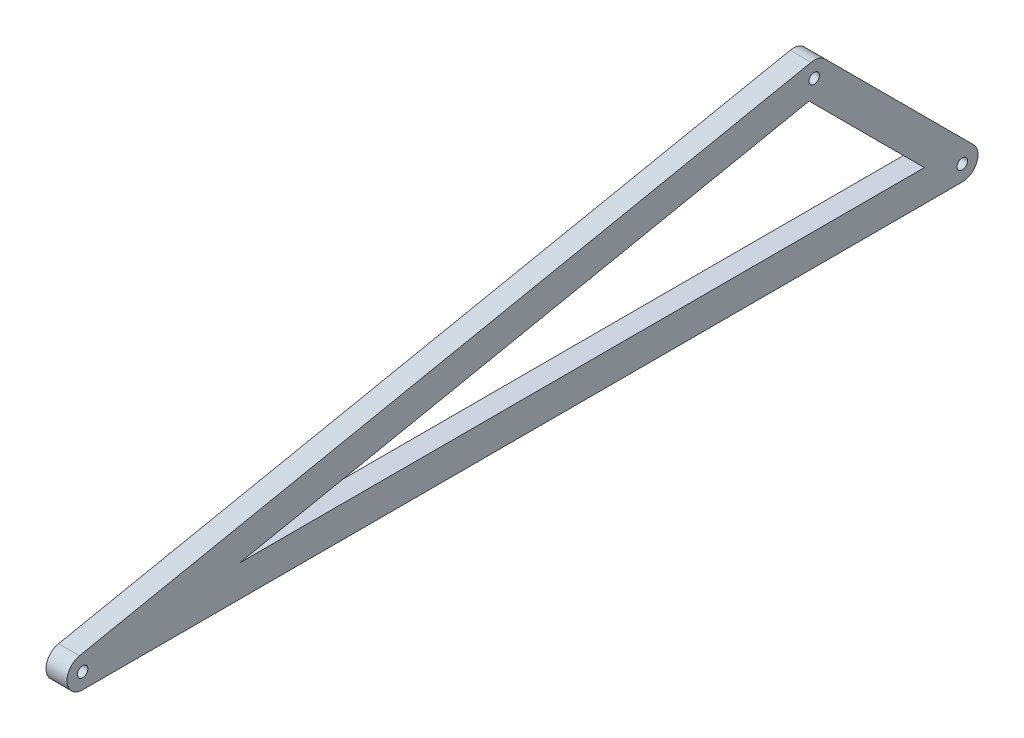
ISO-10303-21;
HEADER;
FILE_DESCRIPTION(('STEP AP214'),'2;1');
FILE_NAME('part.step','',(''),(''),'','','');
FILE_SCHEMA(('AUTOMOTIVE_DESIGN { 1 0 10303 214 1 1 1 1 }'));
ENDSEC;
DATA;
#1=APPLICATION_CONTEXT('core data for automotive mechanical design processes');
#2=APPLICATION_PROTOCOL_DEFINITION('international standard','automotive_design',2000,#1);
#3=PRODUCT_CONTEXT('',#1,'mechanical');
#4=PRODUCT('Part','Part','',(#3));
#5=PRODUCT_RELATED_PRODUCT_CATEGORY('part','',(#4));
#6=PRODUCT_DEFINITION_FORMATION('','',#4);
#7=PRODUCT_DEFINITION_CONTEXT('part definition',#1,'design');
#8=PRODUCT_DEFINITION('design','',#6,#7);
#9=PRODUCT_DEFINITION_SHAPE('','',#8);
#10=(LENGTH_UNIT() NAMED_UNIT(*) SI_UNIT(.MILLI.,.METRE.));
#11=(NAMED_UNIT(*) PLANE_ANGLE_UNIT() SI_UNIT($,.RADIAN.));
#12=(NAMED_UNIT(*) SI_UNIT($,.STERADIAN.) SOLID_ANGLE_UNIT());
#13=UNCERTAINTY_MEASURE_WITH_UNIT(LENGTH_MEASURE(1.E-05),#10,'distance_accuracy_value','');
#14=(GEOMETRIC_REPRESENTATION_CONTEXT(3) GLOBAL_UNCERTAINTY_ASSIGNED_CONTEXT((#13)) GLOBAL_UNIT_ASSIGNED_CONTEXT((#10,
#11,#12)) REPRESENTATION_CONTEXT('',''));
#15=CARTESIAN_POINT('',(0.,0.,0.));
#16=DIRECTION('',(0.,0.,1.));
#17=DIRECTION('',(1.,0.,0.));
#18=AXIS2_PLACEMENT_3D('',#15,#16,#17);
#19=CARTESIAN_POINT('',(2.,3.02286127487392,-75.2533035137491));
#20=DIRECTION('',(-1.,0.,0.));
#21=DIRECTION('',(0.,0.,1.));
#22=AXIS2_PLACEMENT_3D('',#19,#20,#21);
#23=CYLINDRICAL_SURFACE('',#22,1.5);
#24=DIRECTION('',(-1.,0.,0.));
#25=VECTOR('',#24,1.);
#26=CARTESIAN_POINT('',(90.6727286923234,4.08352144665374,-76.3139636855289));
#27=LINE('',#26,#25);
#28=CARTESIAN_POINT('',(2.,4.08352144665374,-76.3139636855289));
#29=VERTEX_POINT('',#28);
#30=CARTESIAN_POINT('',(0.,4.08352144665374,-76.3139636855289));
#31=VERTEX_POINT('',#30);
#32=EDGE_CURVE('E163',#29,#31,#27,.T.);
#33=ORIENTED_EDGE('',*,*,#32,.F.);
#34=CARTESIAN_POINT('',(2.,3.02286127487392,-75.2533035137491));
#35=DIRECTION('',(1.,0.,0.));
#36=DIRECTION('',(0.,0.,-1.));
#37=AXIS2_PLACEMENT_3D('',#34,#35,#36);
#38=CIRCLE('',#37,1.5);
#39=CARTESIAN_POINT('',(2.,1.52286127487392,-75.2533035137491));
#40=VERTEX_POINT('',#39);
#41=EDGE_CURVE('E103',#40,#29,#38,.T.);
#42=ORIENTED_EDGE('',*,*,#41,.F.);
#43=DIRECTION('',(-1.,0.,0.));
#44=VECTOR('',#43,1.);
#45=CARTESIAN_POINT('',(2.,1.52286127487392,-75.2533035137491));
#46=LINE('',#45,#44);
#47=CARTESIAN_POINT('',(0.,1.52286127487392,-75.2533035137491));
#48=VERTEX_POINT('',#47);
#49=EDGE_CURVE('E89',#40,#48,#46,.T.);
#50=ORIENTED_EDGE('',*,*,#49,.T.);
#51=CARTESIAN_POINT('',(0.,3.02286127487392,-75.2533035137491));
#52=DIRECTION('',(1.,0.,0.));
#53=DIRECTION('',(0.,0.,-1.));
#54=AXIS2_PLACEMENT_3D('',#51,#52,#53);
#55=CIRCLE('',#54,1.5);
#56=EDGE_CURVE('E96',#48,#31,#55,.T.);
#57=ORIENTED_EDGE('',*,*,#56,.T.);
#58=EDGE_LOOP('',(#33,#42,#50,#57));
#59=FACE_BOUND('',#58,.T.);
#60=ADVANCED_FACE('F49',(#59),#23,.T.);
#61=CARTESIAN_POINT('',(2.,3.02286127487392,8.7466964862509));
#62=DIRECTION('',(1.,0.,0.));
#63=DIRECTION('',(0.,0.,-1.));
#64=AXIS2_PLACEMENT_3D('',#61,#62,#63);
#65=PLANE('',#64);
#66=DIRECTION('',(0.,0.,1.));
#67=VECTOR('',#66,1.);
#68=CARTESIAN_POINT('',(2.,4.52286127487392,8.7466964862509));
#69=LINE('',#68,#67);
#70=CARTESIAN_POINT('',(2.,4.52286127487392,-71.6319831701894));
#71=VERTEX_POINT('',#70);
#72=CARTESIAN_POINT('',(2.,4.52286127487393,-6.22270104990553));
#73=VERTEX_POINT('',#72);
#74=EDGE_CURVE('E104',#71,#73,#69,.T.);
#75=ORIENTED_EDGE('',*,*,#74,.T.);
#76=DIRECTION('',(0.,-0.19841658031221,0.980117778972103));
#77=VECTOR('',#76,1.);
#78=CARTESIAN_POINT('',(2.,15.5350867367303,-60.6197577083331));
#79=LINE('',#78,#77);
#80=CARTESIAN_POINT('',(2.,15.5350867367303,-60.6197577083331));
#81=VERTEX_POINT('',#80);
#82=EDGE_CURVE('E155',#81,#73,#79,.T.);
#83=ORIENTED_EDGE('',*,*,#82,.F.);
#84=DIRECTION('',(0.,0.707106781186547,0.707106781186548));
#85=VECTOR('',#84,1.);
#86=CARTESIAN_POINT('',(2.,1.9622011030941,-74.1926433419693));
#87=LINE('',#86,#85);
#88=EDGE_CURVE('E64',#71,#81,#87,.T.);
#89=ORIENTED_EDGE('',*,*,#88,.F.);
#90=EDGE_LOOP('',(#75,#83,#89));
#91=FACE_BOUND('',#90,.T.);
#92=DIRECTION('',(0.,0.,-1.));
#93=VECTOR('',#92,1.);
#94=CARTESIAN_POINT('',(2.,1.52286127487392,8.7466964862509));
#95=LINE('',#94,#93);
#96=CARTESIAN_POINT('',(2.,1.52286127487392,8.7466964862509));
#97=VERTEX_POINT('',#96);
#98=EDGE_CURVE('E73',#97,#40,#95,.T.);
#99=ORIENTED_EDGE('',*,*,#98,.T.);
#100=ORIENTED_EDGE('',*,*,#41,.T.);
#101=DIRECTION('',(0.,-0.707106781186547,-0.707106781186548));
#102=VECTOR('',#101,1.);
#103=CARTESIAN_POINT('',(2.,18.2256570703847,-62.171828061798));
#104=LINE('',#103,#102);
#105=CARTESIAN_POINT('',(2.,18.2256570703847,-62.171828061798));
#106=VERTEX_POINT('',#105);
#107=EDGE_CURVE('E160',#106,#29,#104,.T.);
#108=ORIENTED_EDGE('',*,*,#107,.F.);
#109=CARTESIAN_POINT('',(2.,17.1649968986049,-61.1111678900182));
#110=DIRECTION('',(1.,0.,0.));
#111=DIRECTION('',(0.,0.,-1.));
#112=AXIS2_PLACEMENT_3D('',#109,#110,#111);
#113=CIRCLE('',#112,1.50000000000001);
#114=CARTESIAN_POINT('',(2.,18.635173567063,-60.8135430195498));
#115=VERTEX_POINT('',#114);
#116=EDGE_CURVE('E164',#115,#106,#113,.F.);
#117=ORIENTED_EDGE('',*,*,#116,.F.);
#118=DIRECTION('',(0.,0.19841658031221,-0.980117778972103));
#119=VECTOR('',#118,1.);
#120=CARTESIAN_POINT('',(2.,18.635173567063,-60.8135430195498));
#121=LINE('',#120,#119);
#122=CARTESIAN_POINT('',(2.00000000000003,4.49303794333207,9.04432135671922));
#123=VERTEX_POINT('',#122);
#124=EDGE_CURVE('E168',#123,#115,#121,.T.);
#125=ORIENTED_EDGE('',*,*,#124,.F.);
#126=CARTESIAN_POINT('',(2.,3.02286127487392,8.7466964862509));
#127=DIRECTION('',(1.,0.,0.));
#128=DIRECTION('',(0.,0.,-1.));
#129=AXIS2_PLACEMENT_3D('',#126,#127,#128);
#130=CIRCLE('',#129,1.5);
#131=EDGE_CURVE('E115',#123,#97,#130,.T.);
#132=ORIENTED_EDGE('',*,*,#131,.T.);
#133=EDGE_LOOP('',(#99,#100,#108,#117,#125,#132));
#134=FACE_BOUND('',#133,.T.);
#135=CARTESIAN_POINT('',(2.,3.02286127487392,8.7466964862509));
#136=DIRECTION('',(1.,0.,0.));
#137=DIRECTION('',(0.,0.,-1.));
#138=AXIS2_PLACEMENT_3D('',#135,#136,#137);
#139=CIRCLE('',#138,0.499999999999999);
#140=CARTESIAN_POINT('',(2.,3.02286127487392,8.24669648625091));
#141=VERTEX_POINT('',#140);
#142=EDGE_CURVE('E187',#141,#141,#139,.T.);
#143=ORIENTED_EDGE('',*,*,#142,.F.);
#144=EDGE_LOOP('',(#143));
#145=FACE_BOUND('',#144,.T.);
#146=CARTESIAN_POINT('',(2.,17.1649968986049,-61.1111678900182));
#147=DIRECTION('',(1.,0.,0.));
#148=DIRECTION('',(0.,0.,-1.));
#149=AXIS2_PLACEMENT_3D('',#146,#147,#148);
#150=CIRCLE('',#149,0.499999999999999);
#151=CARTESIAN_POINT('',(2.,17.1649968986049,-61.6111678900182));
#152=VERTEX_POINT('',#151);
#153=EDGE_CURVE('E151',#152,#152,#150,.F.);
#154=ORIENTED_EDGE('',*,*,#153,.T.);
#155=EDGE_LOOP('',(#154));
#156=FACE_BOUND('',#155,.T.);
#157=CARTESIAN_POINT('',(2.,3.02286127487392,-75.2533035137491));
#158=DIRECTION('',(1.,0.,0.));
#159=DIRECTION('',(0.,0.,-1.));
#160=AXIS2_PLACEMENT_3D('',#157,#158,#159);
#161=CIRCLE('',#160,0.499999999999999);
#162=CARTESIAN_POINT('',(2.,3.02286127487392,-75.7533035137491));
#163=VERTEX_POINT('',#162);
#164=EDGE_CURVE('E181',#163,#163,#161,.T.);
#165=ORIENTED_EDGE('',*,*,#164,.F.);
#166=EDGE_LOOP('',(#165));
#167=FACE_BOUND('',#166,.T.);
#168=ADVANCED_FACE('F231',(#91,#134,#145,#156,#167),#65,.T.);
#169=CARTESIAN_POINT('',(0.,3.02286127487392,8.7466964862509));
#170=DIRECTION('',(1.,0.,0.));
#171=DIRECTION('',(0.,0.,-1.));
#172=AXIS2_PLACEMENT_3D('',#169,#170,#171);
#173=PLANE('',#172);
#174=DIRECTION('',(0.,-0.19841658031221,0.980117778972103));
#175=VECTOR('',#174,1.);
#176=CARTESIAN_POINT('',(0.,15.5350867367303,-60.6197577083331));
#177=LINE('',#176,#175);
#178=CARTESIAN_POINT('',(0.,15.5350867367303,-60.6197577083331));
#179=VERTEX_POINT('',#178);
#180=CARTESIAN_POINT('',(0.,4.52286127487393,-6.22270104990553));
#181=VERTEX_POINT('',#180);
#182=EDGE_CURVE('E134',#179,#181,#177,.T.);
#183=ORIENTED_EDGE('',*,*,#182,.T.);
#184=DIRECTION('',(0.,0.,1.));
#185=VECTOR('',#184,1.);
#186=CARTESIAN_POINT('',(0.,4.52286127487392,8.7466964862509));
#187=LINE('',#186,#185);
#188=CARTESIAN_POINT('',(0.,4.52286127487392,-71.6319831701895));
#189=VERTEX_POINT('',#188);
#190=EDGE_CURVE('E112',#189,#181,#187,.T.);
#191=ORIENTED_EDGE('',*,*,#190,.F.);
#192=DIRECTION('',(0.,0.707106781186547,0.707106781186548));
#193=VECTOR('',#192,1.);
#194=CARTESIAN_POINT('',(0.,1.9622011030941,-74.1926433419693));
#195=LINE('',#194,#193);
#196=EDGE_CURVE('E131',#189,#179,#195,.T.);
#197=ORIENTED_EDGE('',*,*,#196,.T.);
#198=EDGE_LOOP('',(#183,#191,#197));
#199=FACE_BOUND('',#198,.T.);
#200=ORIENTED_EDGE('',*,*,#56,.F.);
#201=DIRECTION('',(0.,0.,-1.));
#202=VECTOR('',#201,1.);
#203=CARTESIAN_POINT('',(0.,1.52286127487392,8.7466964862509));
#204=LINE('',#203,#202);
#205=CARTESIAN_POINT('',(0.,1.52286127487392,8.7466964862509));
#206=VERTEX_POINT('',#205);
#207=EDGE_CURVE('E86',#206,#48,#204,.T.);
#208=ORIENTED_EDGE('',*,*,#207,.F.);
#209=CARTESIAN_POINT('',(0.,3.02286127487392,8.7466964862509));
#210=DIRECTION('',(1.,0.,0.));
#211=DIRECTION('',(0.,0.,-1.));
#212=AXIS2_PLACEMENT_3D('',#209,#210,#211);
#213=CIRCLE('',#212,1.5);
#214=CARTESIAN_POINT('',(0.,4.49303794333207,9.04432135671922));
#215=VERTEX_POINT('',#214);
#216=EDGE_CURVE('E97',#215,#206,#213,.T.);
#217=ORIENTED_EDGE('',*,*,#216,.F.);
#218=DIRECTION('',(0.,0.19841658031221,-0.980117778972103));
#219=VECTOR('',#218,1.);
#220=CARTESIAN_POINT('',(0.,18.635173567063,-60.8135430195498));
#221=LINE('',#220,#219);
#222=CARTESIAN_POINT('',(0.,18.635173567063,-60.8135430195498));
#223=VERTEX_POINT('',#222);
#224=EDGE_CURVE('E140',#215,#223,#221,.T.);
#225=ORIENTED_EDGE('',*,*,#224,.T.);
#226=CARTESIAN_POINT('',(0.,17.1649968986049,-61.1111678900182));
#227=DIRECTION('',(-1.,0.,0.));
#228=DIRECTION('',(0.,0.,1.));
#229=AXIS2_PLACEMENT_3D('',#226,#227,#228);
#230=CIRCLE('',#229,1.50000000000001);
#231=CARTESIAN_POINT('',(0.,18.2256570703847,-62.171828061798));
#232=VERTEX_POINT('',#231);
#233=EDGE_CURVE('E144',#223,#232,#230,.T.);
#234=ORIENTED_EDGE('',*,*,#233,.T.);
#235=DIRECTION('',(0.,-0.707106781186547,-0.707106781186548));
#236=VECTOR('',#235,1.);
#237=CARTESIAN_POINT('',(0.,18.2256570703847,-62.171828061798));
#238=LINE('',#237,#236);
#239=EDGE_CURVE('E111',#232,#31,#238,.T.);
#240=ORIENTED_EDGE('',*,*,#239,.T.);
#241=EDGE_LOOP('',(#200,#208,#217,#225,#234,#240));
#242=FACE_BOUND('',#241,.T.);
#243=CARTESIAN_POINT('',(0.,3.02286127487392,8.7466964862509));
#244=DIRECTION('',(1.,0.,0.));
#245=DIRECTION('',(0.,0.,-1.));
#246=AXIS2_PLACEMENT_3D('',#243,#244,#245);
#247=CIRCLE('',#246,0.499999999999999);
#248=CARTESIAN_POINT('',(0.,3.02286127487392,8.24669648625091));
#249=VERTEX_POINT('',#248);
#250=EDGE_CURVE('E184',#249,#249,#247,.T.);
#251=ORIENTED_EDGE('',*,*,#250,.T.);
#252=EDGE_LOOP('',(#251));
#253=FACE_BOUND('',#252,.T.);
#254=CARTESIAN_POINT('',(0.,3.02286127487392,-75.2533035137491));
#255=DIRECTION('',(1.,0.,0.));
#256=DIRECTION('',(0.,0.,-1.));
#257=AXIS2_PLACEMENT_3D('',#254,#255,#256);
#258=CIRCLE('',#257,0.499999999999999);
#259=CARTESIAN_POINT('',(0.,3.02286127487392,-75.7533035137491));
#260=VERTEX_POINT('',#259);
#261=EDGE_CURVE('E154',#260,#260,#258,.T.);
#262=ORIENTED_EDGE('',*,*,#261,.T.);
#263=EDGE_LOOP('',(#262));
#264=FACE_BOUND('',#263,.T.);
#265=CARTESIAN_POINT('',(0.,17.1649968986049,-61.1111678900182));
#266=DIRECTION('',(-1.,0.,0.));
#267=DIRECTION('',(0.,0.,1.));
#268=AXIS2_PLACEMENT_3D('',#265,#266,#267);
#269=CIRCLE('',#268,0.499999999999999);
#270=CARTESIAN_POINT('',(0.,17.1649968986049,-60.6111678900182));
#271=VERTEX_POINT('',#270);
#272=EDGE_CURVE('E141',#271,#271,#269,.T.);
#273=ORIENTED_EDGE('',*,*,#272,.F.);
#274=EDGE_LOOP('',(#273));
#275=FACE_BOUND('',#274,.T.);
#276=ADVANCED_FACE('F107',(#199,#242,#253,#264,#275),#173,.F.);
#277=CARTESIAN_POINT('',(2.,3.02286127487392,8.7466964862509));
#278=DIRECTION('',(-1.,0.,0.));
#279=DIRECTION('',(0.,0.,1.));
#280=AXIS2_PLACEMENT_3D('',#277,#278,#279);
#281=CYLINDRICAL_SURFACE('',#280,1.5);
#282=ORIENTED_EDGE('',*,*,#131,.F.);
#283=DIRECTION('',(-1.,0.,0.));
#284=VECTOR('',#283,1.);
#285=CARTESIAN_POINT('',(90.6727286923234,4.49303794333207,9.04432135671922));
#286=LINE('',#285,#284);
#287=EDGE_CURVE('E147',#123,#215,#286,.T.);
#288=ORIENTED_EDGE('',*,*,#287,.T.);
#289=ORIENTED_EDGE('',*,*,#216,.T.);
#290=DIRECTION('',(-1.,0.,0.));
#291=VECTOR('',#290,1.);
#292=CARTESIAN_POINT('',(2.,1.52286127487392,8.7466964862509));
#293=LINE('',#292,#291);
#294=EDGE_CURVE('E92',#97,#206,#293,.T.);
#295=ORIENTED_EDGE('',*,*,#294,.F.);
#296=EDGE_LOOP('',(#282,#288,#289,#295));
#297=FACE_BOUND('',#296,.T.);
#298=ADVANCED_FACE('F51',(#297),#281,.T.);
#299=CARTESIAN_POINT('',(2.,1.52286127487392,8.7466964862509));
#300=DIRECTION('',(0.,1.,0.));
#301=DIRECTION('',(0.,0.,1.));
#302=AXIS2_PLACEMENT_3D('',#299,#300,#301);
#303=PLANE('',#302);
#304=ORIENTED_EDGE('',*,*,#207,.T.);
#305=ORIENTED_EDGE('',*,*,#49,.F.);
#306=ORIENTED_EDGE('',*,*,#98,.F.);
#307=ORIENTED_EDGE('',*,*,#294,.T.);
#308=EDGE_LOOP('',(#304,#305,#306,#307));
#309=FACE_BOUND('',#308,.T.);
#310=ADVANCED_FACE('F88',(#309),#303,.F.);
#311=CARTESIAN_POINT('',(2.,4.52286127487392,8.7466964862509));
#312=DIRECTION('',(0.,-1.,0.));
#313=DIRECTION('',(0.,0.,-1.));
#314=AXIS2_PLACEMENT_3D('',#311,#312,#313);
#315=PLANE('',#314);
#316=ORIENTED_EDGE('',*,*,#190,.T.);
#317=DIRECTION('',(1.,0.,0.));
#318=VECTOR('',#317,1.);
#319=CARTESIAN_POINT('',(2.,4.52286127487392,-6.22270104990543));
#320=LINE('',#319,#318);
#321=EDGE_CURVE('E11',#181,#73,#320,.T.);
#322=ORIENTED_EDGE('',*,*,#321,.T.);
#323=ORIENTED_EDGE('',*,*,#74,.F.);
#324=DIRECTION('',(-1.,0.,0.));
#325=VECTOR('',#324,1.);
#326=CARTESIAN_POINT('',(2.,4.52286127487392,-71.6319831701895));
#327=LINE('',#326,#325);
#328=EDGE_CURVE('E57',#71,#189,#327,.T.);
#329=ORIENTED_EDGE('',*,*,#328,.T.);
#330=EDGE_LOOP('',(#316,#322,#323,#329));
#331=FACE_BOUND('',#330,.T.);
#332=ADVANCED_FACE('F123',(#331),#315,.F.);
#333=CARTESIAN_POINT('',(2.,3.02286127487392,8.7466964862509));
#334=DIRECTION('',(-1.,0.,0.));
#335=DIRECTION('',(0.,0.,1.));
#336=AXIS2_PLACEMENT_3D('',#333,#334,#335);
#337=CYLINDRICAL_SURFACE('',#336,0.499999999999999);
#338=ORIENTED_EDGE('',*,*,#142,.T.);
#339=EDGE_LOOP('',(#338));
#340=FACE_BOUND('',#339,.T.);
#341=ORIENTED_EDGE('',*,*,#250,.F.);
#342=EDGE_LOOP('',(#341));
#343=FACE_BOUND('',#342,.T.);
#344=ADVANCED_FACE('F260',(#340,#343),#337,.F.);
#345=CARTESIAN_POINT('',(2.,3.02286127487392,-75.2533035137491));
#346=DIRECTION('',(-1.,0.,0.));
#347=DIRECTION('',(0.,0.,1.));
#348=AXIS2_PLACEMENT_3D('',#345,#346,#347);
#349=CYLINDRICAL_SURFACE('',#348,0.499999999999999);
#350=ORIENTED_EDGE('',*,*,#164,.T.);
#351=EDGE_LOOP('',(#350));
#352=FACE_BOUND('',#351,.T.);
#353=ORIENTED_EDGE('',*,*,#261,.F.);
#354=EDGE_LOOP('',(#353));
#355=FACE_BOUND('',#354,.T.);
#356=ADVANCED_FACE('F271',(#352,#355),#349,.F.);
#357=CARTESIAN_POINT('',(90.6727286923234,15.5350867367303,-60.6197577083331));
#358=DIRECTION('',(0.,-0.980117778972103,-0.19841658031221));
#359=DIRECTION('',(0.,0.19841658031221,-0.980117778972103));
#360=AXIS2_PLACEMENT_3D('',#357,#358,#359);
#361=PLANE('',#360);
#362=ORIENTED_EDGE('',*,*,#321,.F.);
#363=ORIENTED_EDGE('',*,*,#182,.F.);
#364=DIRECTION('',(-1.,0.,0.));
#365=VECTOR('',#364,1.);
#366=CARTESIAN_POINT('',(90.6727286923234,15.5350867367303,-60.6197577083331));
#367=LINE('',#366,#365);
#368=EDGE_CURVE('E159',#81,#179,#367,.T.);
#369=ORIENTED_EDGE('',*,*,#368,.F.);
#370=ORIENTED_EDGE('',*,*,#82,.T.);
#371=EDGE_LOOP('',(#362,#363,#369,#370));
#372=FACE_BOUND('',#371,.T.);
#373=ADVANCED_FACE('F274',(#372),#361,.T.);
#374=CARTESIAN_POINT('',(90.6727286923234,1.9622011030941,-74.1926433419693));
#375=DIRECTION('',(0.,-0.707106781186548,0.707106781186547));
#376=DIRECTION('',(0.,-0.707106781186547,-0.707106781186548));
#377=AXIS2_PLACEMENT_3D('',#374,#375,#376);
#378=PLANE('',#377);
#379=ORIENTED_EDGE('',*,*,#328,.F.);
#380=ORIENTED_EDGE('',*,*,#88,.T.);
#381=ORIENTED_EDGE('',*,*,#368,.T.);
#382=ORIENTED_EDGE('',*,*,#196,.F.);
#383=EDGE_LOOP('',(#379,#380,#381,#382));
#384=FACE_BOUND('',#383,.T.);
#385=ADVANCED_FACE('F279',(#384),#378,.T.);
#386=CARTESIAN_POINT('',(90.6727286923234,18.2256570703847,-62.171828061798));
#387=DIRECTION('',(0.,0.707106781186548,-0.707106781186547));
#388=DIRECTION('',(0.,0.707106781186547,0.707106781186548));
#389=AXIS2_PLACEMENT_3D('',#386,#387,#388);
#390=PLANE('',#389);
#391=DIRECTION('',(-1.,0.,0.));
#392=VECTOR('',#391,1.);
#393=CARTESIAN_POINT('',(90.6727286923234,18.2256570703847,-62.171828061798));
#394=LINE('',#393,#392);
#395=EDGE_CURVE('E167',#106,#232,#394,.T.);
#396=ORIENTED_EDGE('',*,*,#395,.F.);
#397=ORIENTED_EDGE('',*,*,#107,.T.);
#398=ORIENTED_EDGE('',*,*,#32,.T.);
#399=ORIENTED_EDGE('',*,*,#239,.F.);
#400=EDGE_LOOP('',(#396,#397,#398,#399));
#401=FACE_BOUND('',#400,.T.);
#402=ADVANCED_FACE('F228',(#401),#390,.T.);
#403=CARTESIAN_POINT('',(90.6727286923234,17.1649968986049,-61.1111678900182));
#404=DIRECTION('',(-1.,0.,0.));
#405=DIRECTION('',(0.,0.,1.));
#406=AXIS2_PLACEMENT_3D('',#403,#404,#405);
#407=CYLINDRICAL_SURFACE('',#406,1.50000000000001);
#408=DIRECTION('',(-1.,0.,0.));
#409=VECTOR('',#408,1.);
#410=CARTESIAN_POINT('',(90.6727286923234,18.635173567063,-60.8135430195498));
#411=LINE('',#410,#409);
#412=EDGE_CURVE('E171',#115,#223,#411,.T.);
#413=ORIENTED_EDGE('',*,*,#412,.F.);
#414=ORIENTED_EDGE('',*,*,#116,.T.);
#415=ORIENTED_EDGE('',*,*,#395,.T.);
#416=ORIENTED_EDGE('',*,*,#233,.F.);
#417=EDGE_LOOP('',(#413,#414,#415,#416));
#418=FACE_BOUND('',#417,.T.);
#419=ADVANCED_FACE('F226',(#418),#407,.T.);
#420=CARTESIAN_POINT('',(90.6727286923234,18.635173567063,-60.8135430195498));
#421=DIRECTION('',(0.,0.980117778972103,0.19841658031221));
#422=DIRECTION('',(0.,-0.19841658031221,0.980117778972103));
#423=AXIS2_PLACEMENT_3D('',#420,#421,#422);
#424=PLANE('',#423);
#425=ORIENTED_EDGE('',*,*,#287,.F.);
#426=ORIENTED_EDGE('',*,*,#124,.T.);
#427=ORIENTED_EDGE('',*,*,#412,.T.);
#428=ORIENTED_EDGE('',*,*,#224,.F.);
#429=EDGE_LOOP('',(#425,#426,#427,#428));
#430=FACE_BOUND('',#429,.T.);
#431=ADVANCED_FACE('F233',(#430),#424,.T.);
#432=CARTESIAN_POINT('',(90.6727286923234,17.1649968986049,-61.1111678900182));
#433=DIRECTION('',(-1.,0.,0.));
#434=DIRECTION('',(0.,0.,1.));
#435=AXIS2_PLACEMENT_3D('',#432,#433,#434);
#436=CYLINDRICAL_SURFACE('',#435,0.499999999999999);
#437=ORIENTED_EDGE('',*,*,#272,.T.);
#438=EDGE_LOOP('',(#437));
#439=FACE_BOUND('',#438,.T.);
#440=ORIENTED_EDGE('',*,*,#153,.F.);
#441=EDGE_LOOP('',(#440));
#442=FACE_BOUND('',#441,.T.);
#443=ADVANCED_FACE('F235',(#439,#442),#436,.F.);
#444=CLOSED_SHELL('',(#60,#168,#276,#298,#310,#332,#344,#356,#373,#385,#402,#419,#431,#443));
#445=MANIFOLD_SOLID_BREP('B2',#444);
#446=ADVANCED_BREP_SHAPE_REPRESENTATION('',(#18,#445),#14);
#447=SHAPE_DEFINITION_REPRESENTATION(#9,#446);
ENDSEC;
END-ISO-10303-21;
